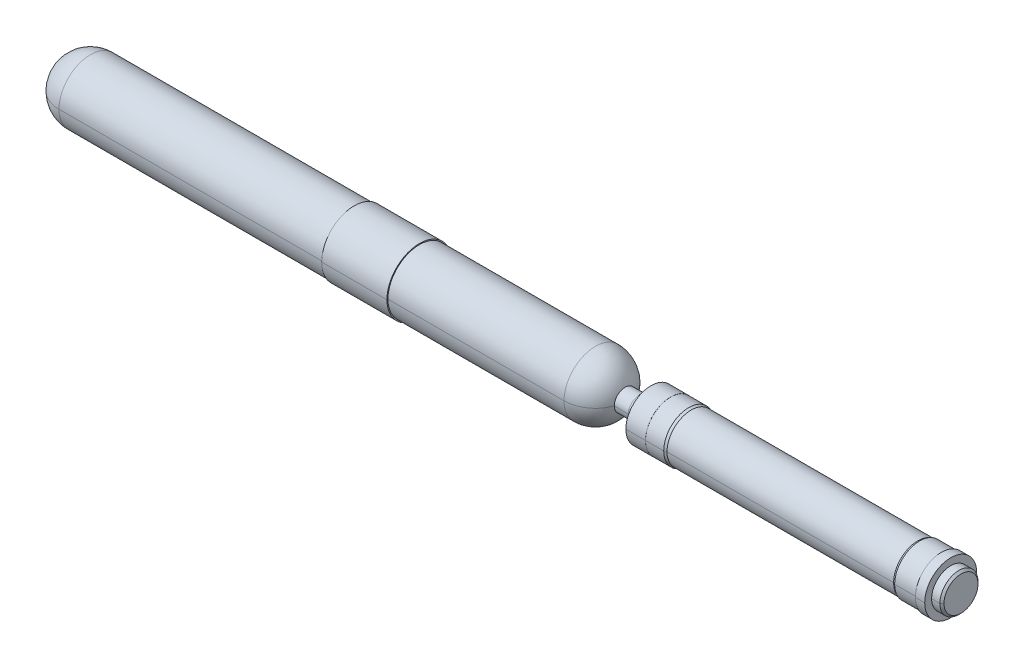
ISO-10303-21;
HEADER;
FILE_DESCRIPTION(('STEP AP214'),'2;1');
FILE_NAME('part.step','',(''),(''),'','','');
FILE_SCHEMA(('AUTOMOTIVE_DESIGN { 1 0 10303 214 1 1 1 1 }'));
ENDSEC;
DATA;
#1=APPLICATION_CONTEXT('core data for automotive mechanical design processes');
#2=APPLICATION_PROTOCOL_DEFINITION('international standard','automotive_design',2000,#1);
#3=PRODUCT_CONTEXT('',#1,'mechanical');
#4=PRODUCT('Part','Part','',(#3));
#5=PRODUCT_RELATED_PRODUCT_CATEGORY('part','',(#4));
#6=PRODUCT_DEFINITION_FORMATION('','',#4);
#7=PRODUCT_DEFINITION_CONTEXT('part definition',#1,'design');
#8=PRODUCT_DEFINITION('design','',#6,#7);
#9=PRODUCT_DEFINITION_SHAPE('','',#8);
#10=(LENGTH_UNIT() NAMED_UNIT(*) SI_UNIT(.MILLI.,.METRE.));
#11=(NAMED_UNIT(*) PLANE_ANGLE_UNIT() SI_UNIT($,.RADIAN.));
#12=(NAMED_UNIT(*) SI_UNIT($,.STERADIAN.) SOLID_ANGLE_UNIT());
#13=UNCERTAINTY_MEASURE_WITH_UNIT(LENGTH_MEASURE(1.E-05),#10,'distance_accuracy_value','');
#14=(GEOMETRIC_REPRESENTATION_CONTEXT(3) GLOBAL_UNCERTAINTY_ASSIGNED_CONTEXT((#13)) GLOBAL_UNIT_ASSIGNED_CONTEXT((#10,
#11,#12)) REPRESENTATION_CONTEXT('',''));
#15=CARTESIAN_POINT('',(0.,0.,0.));
#16=DIRECTION('',(0.,0.,1.));
#17=DIRECTION('',(1.,0.,0.));
#18=AXIS2_PLACEMENT_3D('',#15,#16,#17);
#19=CARTESIAN_POINT('',(203.869686480789,0.,-129.45108941236));
#20=DIRECTION('',(0.,-1.,0.));
#21=DIRECTION('',(0.,0.,-1.));
#22=AXIS2_PLACEMENT_3D('',#19,#20,#21);
#23=SPHERICAL_SURFACE('',#22,49.0220149271394);
#24=CARTESIAN_POINT('',(203.869686480789,0.,-129.45108941236));
#25=DIRECTION('',(0.,-1.,0.));
#26=DIRECTION('',(0.,0.,-1.));
#27=AXIS2_PLACEMENT_3D('',#24,#25,#26);
#28=CIRCLE('',#27,49.0220149271394);
#29=CARTESIAN_POINT('',(203.869686480789,0.,-80.4290744852206));
#30=VERTEX_POINT('',#29);
#31=CARTESIAN_POINT('',(154.84767155365,0.,-129.45108941236));
#32=VERTEX_POINT('',#31);
#33=EDGE_CURVE('E280',#30,#32,#28,.T.);
#34=ORIENTED_EDGE('',*,*,#33,.F.);
#35=CARTESIAN_POINT('',(203.869686480789,0.,-129.45108941236));
#36=DIRECTION('',(-1.,0.,0.));
#37=DIRECTION('',(0.,0.,1.));
#38=AXIS2_PLACEMENT_3D('',#35,#36,#37);
#39=CIRCLE('',#38,49.0220149271394);
#40=CARTESIAN_POINT('',(203.869686480789,0.,-178.473104339499));
#41=VERTEX_POINT('',#40);
#42=EDGE_CURVE('E305',#30,#41,#39,.T.);
#43=ORIENTED_EDGE('',*,*,#42,.T.);
#44=CARTESIAN_POINT('',(203.869686480789,0.,-129.45108941236));
#45=DIRECTION('',(0.,1.,0.));
#46=DIRECTION('',(0.,0.,1.));
#47=AXIS2_PLACEMENT_3D('',#44,#45,#46);
#48=CIRCLE('',#47,49.0220149271394);
#49=EDGE_CURVE('E276',#41,#32,#48,.T.);
#50=ORIENTED_EDGE('',*,*,#49,.T.);
#51=EDGE_LOOP('',(#34,#43,#50));
#52=FACE_BOUND('',#51,.T.);
#53=ADVANCED_FACE('F50',(#52),#23,.T.);
#54=CARTESIAN_POINT('',(154.84767155365,0.,-129.45108941236));
#55=DIRECTION('',(-1.,0.,0.));
#56=DIRECTION('',(0.,0.,1.));
#57=AXIS2_PLACEMENT_3D('',#54,#55,#56);
#58=CYLINDRICAL_SURFACE('',#57,49.0220149271394);
#59=DIRECTION('',(-1.,0.,0.));
#60=VECTOR('',#59,1.);
#61=CARTESIAN_POINT('',(154.84767155365,0.,-178.473104339499));
#62=LINE('',#61,#60);
#63=CARTESIAN_POINT('',(614.587811275265,0.,-178.473104339499));
#64=VERTEX_POINT('',#63);
#65=EDGE_CURVE('E308',#64,#41,#62,.T.);
#66=ORIENTED_EDGE('',*,*,#65,.F.);
#67=CARTESIAN_POINT('',(614.587811275265,0.,-129.45108941236));
#68=DIRECTION('',(1.,0.,0.));
#69=DIRECTION('',(0.,0.,1.));
#70=AXIS2_PLACEMENT_3D('',#67,#68,#69);
#71=CIRCLE('',#70,49.0220149271394);
#72=CARTESIAN_POINT('',(614.587811275265,0.,-80.4290744852206));
#73=VERTEX_POINT('',#72);
#74=EDGE_CURVE('E61',#73,#64,#71,.T.);
#75=ORIENTED_EDGE('',*,*,#74,.F.);
#76=DIRECTION('',(-1.,0.,0.));
#77=VECTOR('',#76,1.);
#78=CARTESIAN_POINT('',(154.84767155365,0.,-80.4290744852206));
#79=LINE('',#78,#77);
#80=EDGE_CURVE('E260',#73,#30,#79,.T.);
#81=ORIENTED_EDGE('',*,*,#80,.T.);
#82=CARTESIAN_POINT('',(203.869686480789,0.,-129.45108941236));
#83=DIRECTION('',(-1.,0.,0.));
#84=DIRECTION('',(0.,0.,1.));
#85=AXIS2_PLACEMENT_3D('',#82,#83,#84);
#86=CIRCLE('',#85,49.0220149271394);
#87=EDGE_CURVE('E403',#41,#30,#86,.T.);
#88=ORIENTED_EDGE('',*,*,#87,.F.);
#89=EDGE_LOOP('',(#66,#75,#81,#88));
#90=FACE_BOUND('',#89,.T.);
#91=ADVANCED_FACE('F418',(#90),#58,.T.);
#92=CARTESIAN_POINT('',(716.18784220753,0.,-178.473104339499));
#93=DIRECTION('',(-1.,0.,0.));
#94=DIRECTION('',(0.,0.,1.));
#95=AXIS2_PLACEMENT_3D('',#92,#93,#94);
#96=PLANE('',#95);
#97=CARTESIAN_POINT('',(716.18784220753,0.,-129.45108941236));
#98=DIRECTION('',(1.,0.,0.));
#99=DIRECTION('',(0.,0.,1.));
#100=AXIS2_PLACEMENT_3D('',#97,#98,#99);
#101=CIRCLE('',#100,49.0220149271394);
#102=CARTESIAN_POINT('',(716.18784220753,0.,-80.4290744852206));
#103=VERTEX_POINT('',#102);
#104=CARTESIAN_POINT('',(716.18784220753,0.,-178.473104339499));
#105=VERTEX_POINT('',#104);
#106=EDGE_CURVE('E387',#103,#105,#101,.T.);
#107=ORIENTED_EDGE('',*,*,#106,.F.);
#108=CARTESIAN_POINT('',(716.18784220753,0.,-129.45108941236));
#109=DIRECTION('',(1.,0.,0.));
#110=DIRECTION('',(0.,0.,1.));
#111=AXIS2_PLACEMENT_3D('',#108,#109,#110);
#112=CIRCLE('',#111,49.0220149271394);
#113=EDGE_CURVE('E221',#105,#103,#112,.T.);
#114=ORIENTED_EDGE('',*,*,#113,.F.);
#115=EDGE_LOOP('',(#107,#114));
#116=FACE_BOUND('',#115,.T.);
#117=CARTESIAN_POINT('',(716.18784220753,0.,-129.45108941236));
#118=DIRECTION('',(-1.,0.,0.));
#119=DIRECTION('',(0.,0.,1.));
#120=AXIS2_PLACEMENT_3D('',#117,#118,#119);
#121=CIRCLE('',#120,50.5890234587644);
#122=CARTESIAN_POINT('',(716.18784220753,0.,-78.8620659535956));
#123=VERTEX_POINT('',#122);
#124=CARTESIAN_POINT('',(716.18784220753,0.,-180.040112871125));
#125=VERTEX_POINT('',#124);
#126=EDGE_CURVE('E54',#123,#125,#121,.T.);
#127=ORIENTED_EDGE('',*,*,#126,.F.);
#128=CARTESIAN_POINT('',(716.18784220753,0.,-129.45108941236));
#129=DIRECTION('',(-1.,0.,0.));
#130=DIRECTION('',(0.,0.,1.));
#131=AXIS2_PLACEMENT_3D('',#128,#129,#130);
#132=CIRCLE('',#131,50.5890234587644);
#133=EDGE_CURVE('E11',#125,#123,#132,.T.);
#134=ORIENTED_EDGE('',*,*,#133,.F.);
#135=EDGE_LOOP('',(#127,#134));
#136=FACE_BOUND('',#135,.T.);
#137=ADVANCED_FACE('F646',(#116,#136),#96,.F.);
#138=CARTESIAN_POINT('',(154.84767155365,0.,-129.45108941236));
#139=DIRECTION('',(-1.,0.,0.));
#140=DIRECTION('',(0.,0.,1.));
#141=AXIS2_PLACEMENT_3D('',#138,#139,#140);
#142=CYLINDRICAL_SURFACE('',#141,50.5890234587644);
#143=DIRECTION('',(-1.,0.,0.));
#144=VECTOR('',#143,1.);
#145=CARTESIAN_POINT('',(154.84767155365,0.,-180.040112871125));
#146=LINE('',#145,#144);
#147=CARTESIAN_POINT('',(614.587811275265,0.,-180.040112871125));
#148=VERTEX_POINT('',#147);
#149=EDGE_CURVE('E478',#125,#148,#146,.T.);
#150=ORIENTED_EDGE('',*,*,#149,.F.);
#151=ORIENTED_EDGE('',*,*,#133,.T.);
#152=DIRECTION('',(-1.,0.,0.));
#153=VECTOR('',#152,1.);
#154=CARTESIAN_POINT('',(154.84767155365,0.,-78.8620659535956));
#155=LINE('',#154,#153);
#156=CARTESIAN_POINT('',(614.587811275265,0.,-78.8620659535956));
#157=VERTEX_POINT('',#156);
#158=EDGE_CURVE('E399',#123,#157,#155,.T.);
#159=ORIENTED_EDGE('',*,*,#158,.T.);
#160=CARTESIAN_POINT('',(614.587811275265,0.,-129.45108941236));
#161=DIRECTION('',(-1.,0.,0.));
#162=DIRECTION('',(0.,0.,1.));
#163=AXIS2_PLACEMENT_3D('',#160,#161,#162);
#164=CIRCLE('',#163,50.5890234587644);
#165=EDGE_CURVE('E383',#148,#157,#164,.T.);
#166=ORIENTED_EDGE('',*,*,#165,.F.);
#167=EDGE_LOOP('',(#150,#151,#159,#166));
#168=FACE_BOUND('',#167,.T.);
#169=ADVANCED_FACE('F635',(#168),#142,.T.);
#170=CARTESIAN_POINT('',(614.587811275265,0.,-178.473104339499));
#171=DIRECTION('',(-1.,0.,0.));
#172=DIRECTION('',(0.,0.,1.));
#173=AXIS2_PLACEMENT_3D('',#170,#171,#172);
#174=PLANE('',#173);
#175=ORIENTED_EDGE('',*,*,#74,.T.);
#176=CARTESIAN_POINT('',(614.587811275265,0.,-129.45108941236));
#177=DIRECTION('',(1.,0.,0.));
#178=DIRECTION('',(0.,0.,1.));
#179=AXIS2_PLACEMENT_3D('',#176,#177,#178);
#180=CIRCLE('',#179,49.0220149271394);
#181=EDGE_CURVE('E279',#64,#73,#180,.T.);
#182=ORIENTED_EDGE('',*,*,#181,.T.);
#183=EDGE_LOOP('',(#175,#182));
#184=FACE_BOUND('',#183,.T.);
#185=CARTESIAN_POINT('',(614.587811275265,0.,-129.45108941236));
#186=DIRECTION('',(-1.,0.,0.));
#187=DIRECTION('',(0.,0.,1.));
#188=AXIS2_PLACEMENT_3D('',#185,#186,#187);
#189=CIRCLE('',#188,50.5890234587644);
#190=EDGE_CURVE('E404',#157,#148,#189,.T.);
#191=ORIENTED_EDGE('',*,*,#190,.T.);
#192=ORIENTED_EDGE('',*,*,#165,.T.);
#193=EDGE_LOOP('',(#191,#192));
#194=FACE_BOUND('',#193,.T.);
#195=ADVANCED_FACE('F632',(#184,#194),#174,.T.);
#196=CARTESIAN_POINT('',(154.84767155365,0.,-129.45108941236));
#197=DIRECTION('',(-1.,0.,0.));
#198=DIRECTION('',(0.,0.,1.));
#199=AXIS2_PLACEMENT_3D('',#196,#197,#198);
#200=CYLINDRICAL_SURFACE('',#199,49.0220149271394);
#201=DIRECTION('',(-1.,0.,0.));
#202=VECTOR('',#201,1.);
#203=CARTESIAN_POINT('',(154.84767155365,0.,-178.473104339499));
#204=LINE('',#203,#202);
#205=CARTESIAN_POINT('',(990.357763279767,0.,-178.473104339499));
#206=VERTEX_POINT('',#205);
#207=EDGE_CURVE('E226',#206,#105,#204,.T.);
#208=ORIENTED_EDGE('',*,*,#207,.F.);
#209=CARTESIAN_POINT('',(990.357763279767,0.,-129.45108941236));
#210=DIRECTION('',(-1.,0.,0.));
#211=DIRECTION('',(0.,0.,1.));
#212=AXIS2_PLACEMENT_3D('',#209,#210,#211);
#213=CIRCLE('',#212,49.0220149271394);
#214=CARTESIAN_POINT('',(990.357763279767,0.,-80.4290744852206));
#215=VERTEX_POINT('',#214);
#216=EDGE_CURVE('E318',#206,#215,#213,.T.);
#217=ORIENTED_EDGE('',*,*,#216,.T.);
#218=DIRECTION('',(-1.,0.,0.));
#219=VECTOR('',#218,1.);
#220=CARTESIAN_POINT('',(154.84767155365,0.,-80.4290744852206));
#221=LINE('',#220,#219);
#222=EDGE_CURVE('E225',#215,#103,#221,.T.);
#223=ORIENTED_EDGE('',*,*,#222,.T.);
#224=ORIENTED_EDGE('',*,*,#106,.T.);
#225=EDGE_LOOP('',(#208,#217,#223,#224));
#226=FACE_BOUND('',#225,.T.);
#227=ADVANCED_FACE('F507',(#226),#200,.T.);
#228=CARTESIAN_POINT('',(990.357763279767,0.,-129.45108941236));
#229=DIRECTION('',(0.,-1.,0.));
#230=DIRECTION('',(0.,0.,-1.));
#231=AXIS2_PLACEMENT_3D('',#228,#229,#230);
#232=SPHERICAL_SURFACE('',#231,49.0220149271394);
#233=CARTESIAN_POINT('',(990.357763279767,0.,-129.45108941236));
#234=DIRECTION('',(0.,-1.,0.));
#235=DIRECTION('',(0.,0.,-1.));
#236=AXIS2_PLACEMENT_3D('',#233,#234,#235);
#237=CIRCLE('',#236,49.0220149271394);
#238=CARTESIAN_POINT('',(1036.40785754293,0.,-112.641961955227));
#239=VERTEX_POINT('',#238);
#240=EDGE_CURVE('E323',#239,#215,#237,.T.);
#241=ORIENTED_EDGE('',*,*,#240,.F.);
#242=CARTESIAN_POINT('',(1036.40785754293,0.,-129.45108941236));
#243=DIRECTION('',(-1.,0.,0.));
#244=DIRECTION('',(0.,0.,1.));
#245=AXIS2_PLACEMENT_3D('',#242,#243,#244);
#246=CIRCLE('',#245,16.8091274571327);
#247=CARTESIAN_POINT('',(1036.40785754293,0.,-146.260216869493));
#248=VERTEX_POINT('',#247);
#249=EDGE_CURVE('E408',#239,#248,#246,.T.);
#250=ORIENTED_EDGE('',*,*,#249,.T.);
#251=CARTESIAN_POINT('',(990.357763279767,0.,-129.45108941236));
#252=DIRECTION('',(0.,1.,0.));
#253=DIRECTION('',(0.,0.,1.));
#254=AXIS2_PLACEMENT_3D('',#251,#252,#253);
#255=CIRCLE('',#254,49.0220149271394);
#256=EDGE_CURVE('E322',#248,#206,#255,.T.);
#257=ORIENTED_EDGE('',*,*,#256,.T.);
#258=CARTESIAN_POINT('',(990.357763279767,0.,-129.45108941236));
#259=DIRECTION('',(-1.,0.,0.));
#260=DIRECTION('',(0.,0.,1.));
#261=AXIS2_PLACEMENT_3D('',#258,#259,#260);
#262=CIRCLE('',#261,49.0220149271394);
#263=EDGE_CURVE('E256',#215,#206,#262,.T.);
#264=ORIENTED_EDGE('',*,*,#263,.F.);
#265=EDGE_LOOP('',(#241,#250,#257,#264));
#266=FACE_BOUND('',#265,.T.);
#267=ADVANCED_FACE('F846',(#266),#232,.T.);
#268=CARTESIAN_POINT('',(154.84767155365,0.,-129.45108941236));
#269=DIRECTION('',(-1.,0.,0.));
#270=DIRECTION('',(0.,0.,1.));
#271=AXIS2_PLACEMENT_3D('',#268,#269,#270);
#272=CYLINDRICAL_SURFACE('',#271,16.8091274571327);
#273=DIRECTION('',(-1.,0.,0.));
#274=VECTOR('',#273,1.);
#275=CARTESIAN_POINT('',(154.84767155365,0.,-146.260216869493));
#276=LINE('',#275,#274);
#277=CARTESIAN_POINT('',(1059.24265625592,0.,-146.260216869493));
#278=VERTEX_POINT('',#277);
#279=EDGE_CURVE('E391',#278,#248,#276,.T.);
#280=ORIENTED_EDGE('',*,*,#279,.F.);
#281=CARTESIAN_POINT('',(1059.24265625592,0.,-129.45108941236));
#282=DIRECTION('',(-1.,0.,0.));
#283=DIRECTION('',(0.,0.,1.));
#284=AXIS2_PLACEMENT_3D('',#281,#282,#283);
#285=CIRCLE('',#284,16.8091274571326);
#286=CARTESIAN_POINT('',(1059.24265625592,0.,-112.641961955227));
#287=VERTEX_POINT('',#286);
#288=EDGE_CURVE('E381',#278,#287,#285,.T.);
#289=ORIENTED_EDGE('',*,*,#288,.T.);
#290=DIRECTION('',(-1.,0.,0.));
#291=VECTOR('',#290,1.);
#292=CARTESIAN_POINT('',(154.84767155365,0.,-112.641961955227));
#293=LINE('',#292,#291);
#294=EDGE_CURVE('E474',#287,#239,#293,.T.);
#295=ORIENTED_EDGE('',*,*,#294,.T.);
#296=CARTESIAN_POINT('',(1036.40785754293,0.,-129.45108941236));
#297=DIRECTION('',(-1.,0.,0.));
#298=DIRECTION('',(0.,0.,1.));
#299=AXIS2_PLACEMENT_3D('',#296,#297,#298);
#300=CIRCLE('',#299,16.8091274571327);
#301=EDGE_CURVE('E252',#248,#239,#300,.T.);
#302=ORIENTED_EDGE('',*,*,#301,.F.);
#303=EDGE_LOOP('',(#280,#289,#295,#302));
#304=FACE_BOUND('',#303,.T.);
#305=ADVANCED_FACE('F850',(#304),#272,.T.);
#306=CARTESIAN_POINT('',(1059.24265625592,0.,-146.260216869493));
#307=DIRECTION('',(-1.,0.,0.));
#308=DIRECTION('',(0.,0.,1.));
#309=AXIS2_PLACEMENT_3D('',#306,#307,#308);
#310=PLANE('',#309);
#311=CARTESIAN_POINT('',(1059.24265625592,0.,-129.45108941236));
#312=DIRECTION('',(-1.,0.,0.));
#313=DIRECTION('',(0.,0.,1.));
#314=AXIS2_PLACEMENT_3D('',#311,#312,#313);
#315=CIRCLE('',#314,16.8091274571326);
#316=EDGE_CURVE('E388',#287,#278,#315,.T.);
#317=ORIENTED_EDGE('',*,*,#316,.F.);
#318=ORIENTED_EDGE('',*,*,#288,.F.);
#319=EDGE_LOOP('',(#317,#318));
#320=FACE_BOUND('',#319,.T.);
#321=CARTESIAN_POINT('',(1059.24265625592,0.,-129.45108941236));
#322=DIRECTION('',(-1.,0.,0.));
#323=DIRECTION('',(0.,0.,1.));
#324=AXIS2_PLACEMENT_3D('',#321,#322,#323);
#325=CIRCLE('',#324,18.1868829999213);
#326=CARTESIAN_POINT('',(1059.24265625592,0.,-111.264206412439));
#327=VERTEX_POINT('',#326);
#328=CARTESIAN_POINT('',(1059.24265625592,0.,-147.637972412281));
#329=VERTEX_POINT('',#328);
#330=EDGE_CURVE('E489',#327,#329,#325,.T.);
#331=ORIENTED_EDGE('',*,*,#330,.T.);
#332=CARTESIAN_POINT('',(1059.24265625592,0.,-129.45108941236));
#333=DIRECTION('',(-1.,0.,0.));
#334=DIRECTION('',(0.,0.,1.));
#335=AXIS2_PLACEMENT_3D('',#332,#333,#334);
#336=CIRCLE('',#335,18.1868829999213);
#337=EDGE_CURVE('E378',#329,#327,#336,.T.);
#338=ORIENTED_EDGE('',*,*,#337,.T.);
#339=EDGE_LOOP('',(#331,#338));
#340=FACE_BOUND('',#339,.T.);
#341=ADVANCED_FACE('F755',(#320,#340),#310,.T.);
#342=CARTESIAN_POINT('',(154.84767155365,0.,-129.45108941236));
#343=DIRECTION('',(-1.,0.,0.));
#344=DIRECTION('',(0.,0.,1.));
#345=AXIS2_PLACEMENT_3D('',#342,#343,#344);
#346=CYLINDRICAL_SURFACE('',#345,18.1868829999213);
#347=DIRECTION('',(-1.,0.,0.));
#348=VECTOR('',#347,1.);
#349=CARTESIAN_POINT('',(154.84767155365,0.,-147.637972412281));
#350=LINE('',#349,#348);
#351=CARTESIAN_POINT('',(1069.23021838574,0.,-147.637972412281));
#352=VERTEX_POINT('',#351);
#353=EDGE_CURVE('E485',#352,#329,#350,.T.);
#354=ORIENTED_EDGE('',*,*,#353,.F.);
#355=CARTESIAN_POINT('',(1069.23021838574,0.,-129.45108941236));
#356=DIRECTION('',(-1.,0.,0.));
#357=DIRECTION('',(0.,0.,1.));
#358=AXIS2_PLACEMENT_3D('',#355,#356,#357);
#359=CIRCLE('',#358,18.1868829999213);
#360=CARTESIAN_POINT('',(1069.23021838574,0.,-111.264206412439));
#361=VERTEX_POINT('',#360);
#362=EDGE_CURVE('E382',#352,#361,#359,.T.);
#363=ORIENTED_EDGE('',*,*,#362,.T.);
#364=DIRECTION('',(-1.,0.,0.));
#365=VECTOR('',#364,1.);
#366=CARTESIAN_POINT('',(154.84767155365,0.,-111.264206412439));
#367=LINE('',#366,#365);
#368=EDGE_CURVE('E232',#361,#327,#367,.T.);
#369=ORIENTED_EDGE('',*,*,#368,.T.);
#370=ORIENTED_EDGE('',*,*,#337,.F.);
#371=EDGE_LOOP('',(#354,#363,#369,#370));
#372=FACE_BOUND('',#371,.T.);
#373=ADVANCED_FACE('F655',(#372),#346,.T.);
#374=CARTESIAN_POINT('',(1069.23021838574,0.,-129.45108941236));
#375=DIRECTION('',(1.,0.,0.));
#376=DIRECTION('',(0.,0.,-1.));
#377=AXIS2_PLACEMENT_3D('',#374,#375,#376);
#378=CONICAL_SURFACE('',#377,18.1868829999213,1.22508116170927);
#379=DIRECTION('',(0.338869615009847,0.,0.940833345509755));
#380=VECTOR('',#379,1.);
#381=CARTESIAN_POINT('',(1069.23021838574,0.,-111.264206412439));
#382=LINE('',#381,#380);
#383=CARTESIAN_POINT('',(1076.78127065806,0.,-90.2995596668755));
#384=VERTEX_POINT('',#383);
#385=EDGE_CURVE('E227',#361,#384,#382,.T.);
#386=ORIENTED_EDGE('',*,*,#385,.F.);
#387=ORIENTED_EDGE('',*,*,#362,.F.);
#388=DIRECTION('',(0.338869615009847,0.,-0.940833345509755));
#389=VECTOR('',#388,1.);
#390=CARTESIAN_POINT('',(1069.23021838574,0.,-147.637972412281));
#391=LINE('',#390,#389);
#392=CARTESIAN_POINT('',(1076.78127065806,0.,-168.602619157844));
#393=VERTEX_POINT('',#392);
#394=EDGE_CURVE('E220',#352,#393,#391,.T.);
#395=ORIENTED_EDGE('',*,*,#394,.T.);
#396=CARTESIAN_POINT('',(1076.78127065806,0.,-129.45108941236));
#397=DIRECTION('',(-1.,0.,0.));
#398=DIRECTION('',(0.,0.,1.));
#399=AXIS2_PLACEMENT_3D('',#396,#397,#398);
#400=CIRCLE('',#399,39.1515297454845);
#401=EDGE_CURVE('E290',#393,#384,#400,.T.);
#402=ORIENTED_EDGE('',*,*,#401,.T.);
#403=EDGE_LOOP('',(#386,#387,#395,#402));
#404=FACE_BOUND('',#403,.T.);
#405=ADVANCED_FACE('F649',(#404),#378,.T.);
#406=CARTESIAN_POINT('',(154.84767155365,0.,-129.45108941236));
#407=DIRECTION('',(-1.,0.,0.));
#408=DIRECTION('',(0.,0.,1.));
#409=AXIS2_PLACEMENT_3D('',#406,#407,#408);
#410=CYLINDRICAL_SURFACE('',#409,39.1515297454845);
#411=DIRECTION('',(-1.,0.,0.));
#412=VECTOR('',#411,1.);
#413=CARTESIAN_POINT('',(154.84767155365,0.,-168.602619157844));
#414=LINE('',#413,#412);
#415=CARTESIAN_POINT('',(1107.32156315835,0.,-168.602619157844));
#416=VERTEX_POINT('',#415);
#417=EDGE_CURVE('E213',#416,#393,#414,.T.);
#418=ORIENTED_EDGE('',*,*,#417,.F.);
#419=CARTESIAN_POINT('',(1107.32156315835,0.,-129.45108941236));
#420=DIRECTION('',(-1.,0.,0.));
#421=DIRECTION('',(0.,0.,1.));
#422=AXIS2_PLACEMENT_3D('',#419,#420,#421);
#423=CIRCLE('',#422,39.1515297454845);
#424=CARTESIAN_POINT('',(1107.32156315835,0.,-90.2995596668755));
#425=VERTEX_POINT('',#424);
#426=EDGE_CURVE('E287',#416,#425,#423,.T.);
#427=ORIENTED_EDGE('',*,*,#426,.T.);
#428=DIRECTION('',(-1.,0.,0.));
#429=VECTOR('',#428,1.);
#430=CARTESIAN_POINT('',(154.84767155365,0.,-90.2995596668755));
#431=LINE('',#430,#429);
#432=EDGE_CURVE('E204',#425,#384,#431,.T.);
#433=ORIENTED_EDGE('',*,*,#432,.T.);
#434=ORIENTED_EDGE('',*,*,#401,.F.);
#435=EDGE_LOOP('',(#418,#427,#433,#434));
#436=FACE_BOUND('',#435,.T.);
#437=ADVANCED_FACE('F654',(#436),#410,.T.);
#438=CARTESIAN_POINT('',(1107.32156315835,0.,-168.602619157844));
#439=DIRECTION('',(1.,0.,0.));
#440=DIRECTION('',(0.,1.,0.));
#441=AXIS2_PLACEMENT_3D('',#438,#439,#440);
#442=PLANE('',#441);
#443=CARTESIAN_POINT('',(1107.32156315835,0.,-129.45108941236));
#444=DIRECTION('',(-1.,0.,0.));
#445=DIRECTION('',(0.,0.,1.));
#446=AXIS2_PLACEMENT_3D('',#443,#444,#445);
#447=CIRCLE('',#446,39.0248573700333);
#448=CARTESIAN_POINT('',(1107.32156315835,0.,-90.4262320423267));
#449=VERTEX_POINT('',#448);
#450=CARTESIAN_POINT('',(1107.32156315835,0.,-168.475946782393));
#451=VERTEX_POINT('',#450);
#452=EDGE_CURVE('E198',#449,#451,#447,.T.);
#453=ORIENTED_EDGE('',*,*,#452,.T.);
#454=CARTESIAN_POINT('',(1107.32156315835,0.,-129.45108941236));
#455=DIRECTION('',(-1.,0.,0.));
#456=DIRECTION('',(0.,0.,1.));
#457=AXIS2_PLACEMENT_3D('',#454,#455,#456);
#458=CIRCLE('',#457,39.0248573700333);
#459=EDGE_CURVE('E178',#451,#449,#458,.T.);
#460=ORIENTED_EDGE('',*,*,#459,.T.);
#461=EDGE_LOOP('',(#453,#460));
#462=FACE_BOUND('',#461,.T.);
#463=CARTESIAN_POINT('',(1107.32156315835,0.,-129.45108941236));
#464=DIRECTION('',(-1.,0.,0.));
#465=DIRECTION('',(0.,0.,1.));
#466=AXIS2_PLACEMENT_3D('',#463,#464,#465);
#467=CIRCLE('',#466,39.1515297454845);
#468=EDGE_CURVE('E217',#425,#416,#467,.T.);
#469=ORIENTED_EDGE('',*,*,#468,.F.);
#470=ORIENTED_EDGE('',*,*,#426,.F.);
#471=EDGE_LOOP('',(#469,#470));
#472=FACE_BOUND('',#471,.T.);
#473=ADVANCED_FACE('F763',(#462,#472),#442,.T.);
#474=CARTESIAN_POINT('',(154.84767155365,0.,-129.45108941236));
#475=DIRECTION('',(-1.,0.,0.));
#476=DIRECTION('',(0.,0.,1.));
#477=AXIS2_PLACEMENT_3D('',#474,#475,#476);
#478=CYLINDRICAL_SURFACE('',#477,39.0248573700333);
#479=DIRECTION('',(-1.,0.,0.));
#480=VECTOR('',#479,1.);
#481=CARTESIAN_POINT('',(154.84767155365,0.,-168.475946782393));
#482=LINE('',#481,#480);
#483=CARTESIAN_POINT('',(1135.59411632197,0.,-168.475946782393));
#484=VERTEX_POINT('',#483);
#485=EDGE_CURVE('E172',#484,#451,#482,.T.);
#486=ORIENTED_EDGE('',*,*,#485,.F.);
#487=CARTESIAN_POINT('',(1135.59411632197,0.,-129.45108941236));
#488=DIRECTION('',(-1.,0.,0.));
#489=DIRECTION('',(0.,0.,1.));
#490=AXIS2_PLACEMENT_3D('',#487,#488,#489);
#491=CIRCLE('',#490,39.0248573700333);
#492=CARTESIAN_POINT('',(1135.59411632197,0.,-90.4262320423267));
#493=VERTEX_POINT('',#492);
#494=EDGE_CURVE('E163',#484,#493,#491,.T.);
#495=ORIENTED_EDGE('',*,*,#494,.T.);
#496=DIRECTION('',(-1.,0.,0.));
#497=VECTOR('',#496,1.);
#498=CARTESIAN_POINT('',(154.84767155365,0.,-90.4262320423267));
#499=LINE('',#498,#497);
#500=EDGE_CURVE('E169',#493,#449,#499,.T.);
#501=ORIENTED_EDGE('',*,*,#500,.T.);
#502=ORIENTED_EDGE('',*,*,#459,.F.);
#503=EDGE_LOOP('',(#486,#495,#501,#502));
#504=FACE_BOUND('',#503,.T.);
#505=ADVANCED_FACE('F165',(#504),#478,.T.);
#506=CARTESIAN_POINT('',(1135.59411632197,0.,-129.45108941236));
#507=DIRECTION('',(-1.,0.,0.));
#508=DIRECTION('',(0.,0.,1.));
#509=AXIS2_PLACEMENT_3D('',#506,#507,#508);
#510=CONICAL_SURFACE('',#509,39.0248573700333,0.345228751143972);
#511=DIRECTION('',(-0.940998065108512,0.,-0.338411940483838));
#512=VECTOR('',#511,1.);
#513=CARTESIAN_POINT('',(1135.59411632197,0.,-168.475946782393));
#514=LINE('',#513,#512);
#515=CARTESIAN_POINT('',(1139.4017592952,0.,-167.106600877211));
#516=VERTEX_POINT('',#515);
#517=EDGE_CURVE('E192',#516,#484,#514,.T.);
#518=ORIENTED_EDGE('',*,*,#517,.F.);
#519=CARTESIAN_POINT('',(1139.4017592952,0.,-129.45108941236));
#520=DIRECTION('',(-1.,0.,0.));
#521=DIRECTION('',(0.,0.,1.));
#522=AXIS2_PLACEMENT_3D('',#519,#520,#521);
#523=CIRCLE('',#522,37.6555114648513);
#524=CARTESIAN_POINT('',(1139.4017592952,0.,-91.7955779475087));
#525=VERTEX_POINT('',#524);
#526=EDGE_CURVE('E179',#516,#525,#523,.T.);
#527=ORIENTED_EDGE('',*,*,#526,.T.);
#528=DIRECTION('',(-0.940998065108512,0.,0.338411940483838));
#529=VECTOR('',#528,1.);
#530=CARTESIAN_POINT('',(1135.59411632197,0.,-90.4262320423267));
#531=LINE('',#530,#529);
#532=EDGE_CURVE('E183',#525,#493,#531,.T.);
#533=ORIENTED_EDGE('',*,*,#532,.T.);
#534=ORIENTED_EDGE('',*,*,#494,.F.);
#535=EDGE_LOOP('',(#518,#527,#533,#534));
#536=FACE_BOUND('',#535,.T.);
#537=ADVANCED_FACE('F184',(#536),#510,.T.);
#538=CARTESIAN_POINT('',(154.84767155365,0.,-129.45108941236));
#539=DIRECTION('',(-1.,0.,0.));
#540=DIRECTION('',(0.,0.,1.));
#541=AXIS2_PLACEMENT_3D('',#538,#539,#540);
#542=CYLINDRICAL_SURFACE('',#541,37.6555114648513);
#543=DIRECTION('',(-1.,0.,0.));
#544=VECTOR('',#543,1.);
#545=CARTESIAN_POINT('',(154.84767155365,0.,-167.106600877211));
#546=LINE('',#545,#544);
#547=CARTESIAN_POINT('',(1492.22538681784,0.,-167.106600877211));
#548=VERTEX_POINT('',#547);
#549=EDGE_CURVE('E309',#548,#516,#546,.T.);
#550=ORIENTED_EDGE('',*,*,#549,.F.);
#551=CARTESIAN_POINT('',(1492.22538681784,0.,-129.45108941236));
#552=DIRECTION('',(-1.,0.,0.));
#553=DIRECTION('',(0.,0.,1.));
#554=AXIS2_PLACEMENT_3D('',#551,#552,#553);
#555=CIRCLE('',#554,37.6555114648513);
#556=CARTESIAN_POINT('',(1492.22538681784,0.,-91.7955779475087));
#557=VERTEX_POINT('',#556);
#558=EDGE_CURVE('E248',#548,#557,#555,.T.);
#559=ORIENTED_EDGE('',*,*,#558,.T.);
#560=DIRECTION('',(-1.,0.,0.));
#561=VECTOR('',#560,1.);
#562=CARTESIAN_POINT('',(154.84767155365,0.,-91.7955779475087));
#563=LINE('',#562,#561);
#564=EDGE_CURVE('E313',#557,#525,#563,.T.);
#565=ORIENTED_EDGE('',*,*,#564,.T.);
#566=ORIENTED_EDGE('',*,*,#526,.F.);
#567=EDGE_LOOP('',(#550,#559,#565,#566));
#568=FACE_BOUND('',#567,.T.);
#569=ADVANCED_FACE('F660',(#568),#542,.T.);
#570=CARTESIAN_POINT('',(1492.22538681784,0.,-129.45108941236));
#571=DIRECTION('',(1.,0.,0.));
#572=DIRECTION('',(0.,0.,-1.));
#573=AXIS2_PLACEMENT_3D('',#570,#571,#572);
#574=CONICAL_SURFACE('',#573,37.6555114648513,0.428583765903435);
#575=DIRECTION('',(0.909555224556997,0.,0.415583076509463));
#576=VECTOR('',#575,1.);
#577=CARTESIAN_POINT('',(1492.22538681784,0.,-91.7955779475087));
#578=LINE('',#577,#576);
#579=CARTESIAN_POINT('',(1495.22237055632,0.,-90.4262320423267));
#580=VERTEX_POINT('',#579);
#581=EDGE_CURVE('E245',#557,#580,#578,.T.);
#582=ORIENTED_EDGE('',*,*,#581,.F.);
#583=ORIENTED_EDGE('',*,*,#558,.F.);
#584=DIRECTION('',(0.909555224556997,0.,-0.415583076509463));
#585=VECTOR('',#584,1.);
#586=CARTESIAN_POINT('',(1492.22538681784,0.,-167.106600877211));
#587=LINE('',#586,#585);
#588=CARTESIAN_POINT('',(1495.22237055632,0.,-168.475946782393));
#589=VERTEX_POINT('',#588);
#590=EDGE_CURVE('E244',#548,#589,#587,.T.);
#591=ORIENTED_EDGE('',*,*,#590,.T.);
#592=CARTESIAN_POINT('',(1495.22237055632,0.,-129.45108941236));
#593=DIRECTION('',(-1.,0.,0.));
#594=DIRECTION('',(0.,0.,1.));
#595=AXIS2_PLACEMENT_3D('',#592,#593,#594);
#596=CIRCLE('',#595,39.0248573700333);
#597=EDGE_CURVE('E452',#589,#580,#596,.T.);
#598=ORIENTED_EDGE('',*,*,#597,.T.);
#599=EDGE_LOOP('',(#582,#583,#591,#598));
#600=FACE_BOUND('',#599,.T.);
#601=ADVANCED_FACE('F664',(#600),#574,.T.);
#602=CARTESIAN_POINT('',(154.84767155365,0.,-129.45108941236));
#603=DIRECTION('',(-1.,0.,0.));
#604=DIRECTION('',(0.,0.,1.));
#605=AXIS2_PLACEMENT_3D('',#602,#603,#604);
#606=CYLINDRICAL_SURFACE('',#605,39.0248573700333);
#607=DIRECTION('',(-1.,0.,0.));
#608=VECTOR('',#607,1.);
#609=CARTESIAN_POINT('',(154.84767155365,0.,-168.475946782393));
#610=LINE('',#609,#608);
#611=CARTESIAN_POINT('',(1528.98808991887,0.,-168.475946782393));
#612=VERTEX_POINT('',#611);
#613=EDGE_CURVE('E261',#612,#589,#610,.T.);
#614=ORIENTED_EDGE('',*,*,#613,.F.);
#615=CARTESIAN_POINT('',(1528.98808991887,0.,-129.45108941236));
#616=DIRECTION('',(-1.,0.,0.));
#617=DIRECTION('',(0.,0.,1.));
#618=AXIS2_PLACEMENT_3D('',#615,#616,#617);
#619=CIRCLE('',#618,39.0248573700333);
#620=CARTESIAN_POINT('',(1528.98808991887,0.,-90.4262320423267));
#621=VERTEX_POINT('',#620);
#622=EDGE_CURVE('E299',#612,#621,#619,.T.);
#623=ORIENTED_EDGE('',*,*,#622,.T.);
#624=DIRECTION('',(-1.,0.,0.));
#625=VECTOR('',#624,1.);
#626=CARTESIAN_POINT('',(154.84767155365,0.,-90.4262320423267));
#627=LINE('',#626,#625);
#628=EDGE_CURVE('E265',#621,#580,#627,.T.);
#629=ORIENTED_EDGE('',*,*,#628,.T.);
#630=ORIENTED_EDGE('',*,*,#597,.F.);
#631=EDGE_LOOP('',(#614,#623,#629,#630));
#632=FACE_BOUND('',#631,.T.);
#633=ADVANCED_FACE('F587',(#632),#606,.T.);
#634=CARTESIAN_POINT('',(1528.98808991887,0.,-168.475946782393));
#635=DIRECTION('',(-1.,0.,0.));
#636=DIRECTION('',(0.,0.,1.));
#637=AXIS2_PLACEMENT_3D('',#634,#635,#636);
#638=PLANE('',#637);
#639=CARTESIAN_POINT('',(1528.98808991887,0.,-129.45108941236));
#640=DIRECTION('',(-1.,0.,0.));
#641=DIRECTION('',(0.,0.,1.));
#642=AXIS2_PLACEMENT_3D('',#639,#640,#641);
#643=CIRCLE('',#642,39.0248573700333);
#644=EDGE_CURVE('E266',#621,#612,#643,.T.);
#645=ORIENTED_EDGE('',*,*,#644,.F.);
#646=ORIENTED_EDGE('',*,*,#622,.F.);
#647=EDGE_LOOP('',(#645,#646));
#648=FACE_BOUND('',#647,.T.);
#649=CARTESIAN_POINT('',(1528.98808991887,0.,-129.45108941236));
#650=DIRECTION('',(-1.,0.,0.));
#651=DIRECTION('',(0.,0.,1.));
#652=AXIS2_PLACEMENT_3D('',#649,#650,#651);
#653=CIRCLE('',#652,40.5190390789063);
#654=CARTESIAN_POINT('',(1528.98808991887,0.,-88.9320503334536));
#655=VERTEX_POINT('',#654);
#656=CARTESIAN_POINT('',(1528.98808991887,0.,-169.970128491267));
#657=VERTEX_POINT('',#656);
#658=EDGE_CURVE('E358',#655,#657,#653,.T.);
#659=ORIENTED_EDGE('',*,*,#658,.T.);
#660=CARTESIAN_POINT('',(1528.98808991887,0.,-129.45108941236));
#661=DIRECTION('',(-1.,0.,0.));
#662=DIRECTION('',(0.,0.,1.));
#663=AXIS2_PLACEMENT_3D('',#660,#661,#662);
#664=CIRCLE('',#663,40.5190390789063);
#665=EDGE_CURVE('E285',#657,#655,#664,.T.);
#666=ORIENTED_EDGE('',*,*,#665,.T.);
#667=EDGE_LOOP('',(#659,#666));
#668=FACE_BOUND('',#667,.T.);
#669=ADVANCED_FACE('F582',(#648,#668),#638,.T.);
#670=CARTESIAN_POINT('',(154.84767155365,0.,-129.45108941236));
#671=DIRECTION('',(-1.,0.,0.));
#672=DIRECTION('',(0.,0.,1.));
#673=AXIS2_PLACEMENT_3D('',#670,#671,#672);
#674=CYLINDRICAL_SURFACE('',#673,40.5190390789063);
#675=DIRECTION('',(-1.,0.,0.));
#676=VECTOR('',#675,1.);
#677=CARTESIAN_POINT('',(154.84767155365,0.,-169.970128491267));
#678=LINE('',#677,#676);
#679=CARTESIAN_POINT('',(1543.49566004502,0.,-169.970128491267));
#680=VERTEX_POINT('',#679);
#681=EDGE_CURVE('E304',#680,#657,#678,.T.);
#682=ORIENTED_EDGE('',*,*,#681,.F.);
#683=CARTESIAN_POINT('',(1543.49566004502,0.,-129.45108941236));
#684=DIRECTION('',(-1.,0.,0.));
#685=DIRECTION('',(0.,0.,1.));
#686=AXIS2_PLACEMENT_3D('',#683,#684,#685);
#687=CIRCLE('',#686,40.5190390789063);
#688=CARTESIAN_POINT('',(1543.49566004502,0.,-88.9320503334536));
#689=VERTEX_POINT('',#688);
#690=EDGE_CURVE('E282',#680,#689,#687,.T.);
#691=ORIENTED_EDGE('',*,*,#690,.T.);
#692=DIRECTION('',(-1.,0.,0.));
#693=VECTOR('',#692,1.);
#694=CARTESIAN_POINT('',(154.84767155365,0.,-88.9320503334536));
#695=LINE('',#694,#693);
#696=EDGE_CURVE('E351',#689,#655,#695,.T.);
#697=ORIENTED_EDGE('',*,*,#696,.T.);
#698=ORIENTED_EDGE('',*,*,#665,.F.);
#699=EDGE_LOOP('',(#682,#691,#697,#698));
#700=FACE_BOUND('',#699,.T.);
#701=ADVANCED_FACE('F679',(#700),#674,.T.);
#702=CARTESIAN_POINT('',(1543.49566004502,0.,-169.970128491267));
#703=DIRECTION('',(1.,0.,0.));
#704=DIRECTION('',(0.,1.,0.));
#705=AXIS2_PLACEMENT_3D('',#702,#703,#704);
#706=PLANE('',#705);
#707=CARTESIAN_POINT('',(1543.49566004502,0.,-129.45108941236));
#708=DIRECTION('',(-1.,0.,0.));
#709=DIRECTION('',(0.,0.,1.));
#710=AXIS2_PLACEMENT_3D('',#707,#708,#709);
#711=CIRCLE('',#710,29.7214020586318);
#712=CARTESIAN_POINT('',(1543.49566004502,0.,-99.7296873537281));
#713=VERTEX_POINT('',#712);
#714=CARTESIAN_POINT('',(1543.49566004502,0.,-159.172491470992));
#715=VERTEX_POINT('',#714);
#716=EDGE_CURVE('E317',#713,#715,#711,.T.);
#717=ORIENTED_EDGE('',*,*,#716,.T.);
#718=CARTESIAN_POINT('',(1543.49566004502,0.,-129.45108941236));
#719=DIRECTION('',(-1.,0.,0.));
#720=DIRECTION('',(0.,0.,1.));
#721=AXIS2_PLACEMENT_3D('',#718,#719,#720);
#722=CIRCLE('',#721,29.7214020586318);
#723=EDGE_CURVE('E286',#715,#713,#722,.T.);
#724=ORIENTED_EDGE('',*,*,#723,.T.);
#725=EDGE_LOOP('',(#717,#724));
#726=FACE_BOUND('',#725,.T.);
#727=CARTESIAN_POINT('',(1543.49566004502,0.,-129.45108941236));
#728=DIRECTION('',(-1.,0.,0.));
#729=DIRECTION('',(0.,0.,1.));
#730=AXIS2_PLACEMENT_3D('',#727,#728,#729);
#731=CIRCLE('',#730,40.5190390789063);
#732=EDGE_CURVE('E300',#689,#680,#731,.T.);
#733=ORIENTED_EDGE('',*,*,#732,.F.);
#734=ORIENTED_EDGE('',*,*,#690,.F.);
#735=EDGE_LOOP('',(#733,#734));
#736=FACE_BOUND('',#735,.T.);
#737=ADVANCED_FACE('F683',(#726,#736),#706,.T.);
#738=CARTESIAN_POINT('',(154.84767155365,0.,-129.45108941236));
#739=DIRECTION('',(-1.,0.,0.));
#740=DIRECTION('',(0.,0.,1.));
#741=AXIS2_PLACEMENT_3D('',#738,#739,#740);
#742=CYLINDRICAL_SURFACE('',#741,29.7214020586318);
#743=DIRECTION('',(-1.,0.,0.));
#744=VECTOR('',#743,1.);
#745=CARTESIAN_POINT('',(154.84767155365,0.,-159.172491470992));
#746=LINE('',#745,#744);
#747=CARTESIAN_POINT('',(1556.24204721176,0.,-159.172491470992));
#748=VERTEX_POINT('',#747);
#749=EDGE_CURVE('E341',#748,#715,#746,.T.);
#750=ORIENTED_EDGE('',*,*,#749,.F.);
#751=CARTESIAN_POINT('',(1556.24204721176,0.,-129.45108941236));
#752=DIRECTION('',(-1.,0.,0.));
#753=DIRECTION('',(0.,0.,1.));
#754=AXIS2_PLACEMENT_3D('',#751,#752,#753);
#755=CIRCLE('',#754,29.7214020586318);
#756=CARTESIAN_POINT('',(1556.24204721176,0.,-99.7296873537281));
#757=VERTEX_POINT('',#756);
#758=EDGE_CURVE('E269',#748,#757,#755,.T.);
#759=ORIENTED_EDGE('',*,*,#758,.T.);
#760=DIRECTION('',(-1.,0.,0.));
#761=VECTOR('',#760,1.);
#762=CARTESIAN_POINT('',(154.84767155365,0.,-99.7296873537281));
#763=LINE('',#762,#761);
#764=EDGE_CURVE('E295',#757,#713,#763,.T.);
#765=ORIENTED_EDGE('',*,*,#764,.T.);
#766=ORIENTED_EDGE('',*,*,#723,.F.);
#767=EDGE_LOOP('',(#750,#759,#765,#766));
#768=FACE_BOUND('',#767,.T.);
#769=ADVANCED_FACE('F342',(#768),#742,.T.);
#770=CARTESIAN_POINT('',(1556.24204721176,0.,-129.45108941236));
#771=DIRECTION('',(-1.,0.,0.));
#772=DIRECTION('',(0.,0.,1.));
#773=AXIS2_PLACEMENT_3D('',#770,#771,#772);
#774=CONICAL_SURFACE('',#773,29.7214020586318,0.783615354597344);
#775=DIRECTION('',(-0.708366292974507,0.,-0.705845021925886));
#776=VECTOR('',#775,1.);
#777=CARTESIAN_POINT('',(1556.24204721176,0.,-159.172491470992));
#778=LINE('',#777,#776);
#779=CARTESIAN_POINT('',(1559.46809913103,0.,-155.95792196045));
#780=VERTEX_POINT('',#779);
#781=EDGE_CURVE('E237',#780,#748,#778,.T.);
#782=ORIENTED_EDGE('',*,*,#781,.F.);
#783=CARTESIAN_POINT('',(1559.46809913103,0.,-129.45108941236));
#784=DIRECTION('',(-1.,0.,0.));
#785=DIRECTION('',(0.,0.,1.));
#786=AXIS2_PLACEMENT_3D('',#783,#784,#785);
#787=CIRCLE('',#786,26.5068325480897);
#788=CARTESIAN_POINT('',(1559.46809913103,0.,-102.94425686427));
#789=VERTEX_POINT('',#788);
#790=EDGE_CURVE('E73',#780,#789,#787,.T.);
#791=ORIENTED_EDGE('',*,*,#790,.T.);
#792=DIRECTION('',(-0.708366292974507,0.,0.705845021925886));
#793=VECTOR('',#792,1.);
#794=CARTESIAN_POINT('',(1556.24204721176,0.,-99.7296873537281));
#795=LINE('',#794,#793);
#796=EDGE_CURVE('E233',#789,#757,#795,.T.);
#797=ORIENTED_EDGE('',*,*,#796,.T.);
#798=ORIENTED_EDGE('',*,*,#758,.F.);
#799=EDGE_LOOP('',(#782,#791,#797,#798));
#800=FACE_BOUND('',#799,.T.);
#801=ADVANCED_FACE('F674',(#800),#774,.T.);
#802=CARTESIAN_POINT('',(1559.46809913103,0.,-155.95792196045));
#803=DIRECTION('',(1.,0.,0.));
#804=DIRECTION('',(0.,1.,0.));
#805=AXIS2_PLACEMENT_3D('',#802,#803,#804);
#806=PLANE('',#805);
#807=CARTESIAN_POINT('',(1559.46809913103,0.,-129.45108941236));
#808=DIRECTION('',(-1.,0.,0.));
#809=DIRECTION('',(0.,0.,1.));
#810=AXIS2_PLACEMENT_3D('',#807,#808,#809);
#811=CIRCLE('',#810,26.5068325480897);
#812=EDGE_CURVE('E291',#789,#780,#811,.T.);
#813=ORIENTED_EDGE('',*,*,#812,.F.);
#814=ORIENTED_EDGE('',*,*,#790,.F.);
#815=EDGE_LOOP('',(#813,#814));
#816=FACE_BOUND('',#815,.T.);
#817=ADVANCED_FACE('F670',(#816),#806,.T.);
#818=CARTESIAN_POINT('',(1556.24204721176,0.,-129.45108941236));
#819=DIRECTION('',(-1.,0.,0.));
#820=DIRECTION('',(0.,0.,1.));
#821=AXIS2_PLACEMENT_3D('',#818,#819,#820);
#822=CONICAL_SURFACE('',#821,29.7214020586318,0.783615354597344);
#823=ORIENTED_EDGE('',*,*,#812,.T.);
#824=ORIENTED_EDGE('',*,*,#781,.T.);
#825=CARTESIAN_POINT('',(1556.24204721176,0.,-129.45108941236));
#826=DIRECTION('',(-1.,0.,0.));
#827=DIRECTION('',(0.,0.,1.));
#828=AXIS2_PLACEMENT_3D('',#825,#826,#827);
#829=CIRCLE('',#828,29.7214020586318);
#830=EDGE_CURVE('E335',#757,#748,#829,.T.);
#831=ORIENTED_EDGE('',*,*,#830,.F.);
#832=ORIENTED_EDGE('',*,*,#796,.F.);
#833=EDGE_LOOP('',(#823,#824,#831,#832));
#834=FACE_BOUND('',#833,.T.);
#835=ADVANCED_FACE('F52',(#834),#822,.T.);
#836=CARTESIAN_POINT('',(154.84767155365,0.,-129.45108941236));
#837=DIRECTION('',(-1.,0.,0.));
#838=DIRECTION('',(0.,0.,1.));
#839=AXIS2_PLACEMENT_3D('',#836,#837,#838);
#840=CYLINDRICAL_SURFACE('',#839,29.7214020586318);
#841=ORIENTED_EDGE('',*,*,#830,.T.);
#842=ORIENTED_EDGE('',*,*,#749,.T.);
#843=ORIENTED_EDGE('',*,*,#716,.F.);
#844=ORIENTED_EDGE('',*,*,#764,.F.);
#845=EDGE_LOOP('',(#841,#842,#843,#844));
#846=FACE_BOUND('',#845,.T.);
#847=ADVANCED_FACE('F349',(#846),#840,.T.);
#848=CARTESIAN_POINT('',(154.84767155365,0.,-129.45108941236));
#849=DIRECTION('',(-1.,0.,0.));
#850=DIRECTION('',(0.,0.,1.));
#851=AXIS2_PLACEMENT_3D('',#848,#849,#850);
#852=CYLINDRICAL_SURFACE('',#851,40.5190390789063);
#853=ORIENTED_EDGE('',*,*,#732,.T.);
#854=ORIENTED_EDGE('',*,*,#681,.T.);
#855=ORIENTED_EDGE('',*,*,#658,.F.);
#856=ORIENTED_EDGE('',*,*,#696,.F.);
#857=EDGE_LOOP('',(#853,#854,#855,#856));
#858=FACE_BOUND('',#857,.T.);
#859=ADVANCED_FACE('F833',(#858),#852,.T.);
#860=CARTESIAN_POINT('',(154.84767155365,0.,-129.45108941236));
#861=DIRECTION('',(-1.,0.,0.));
#862=DIRECTION('',(0.,0.,1.));
#863=AXIS2_PLACEMENT_3D('',#860,#861,#862);
#864=CYLINDRICAL_SURFACE('',#863,39.0248573700333);
#865=ORIENTED_EDGE('',*,*,#644,.T.);
#866=ORIENTED_EDGE('',*,*,#613,.T.);
#867=CARTESIAN_POINT('',(1495.22237055632,0.,-129.45108941236));
#868=DIRECTION('',(-1.,0.,0.));
#869=DIRECTION('',(0.,0.,1.));
#870=AXIS2_PLACEMENT_3D('',#867,#868,#869);
#871=CIRCLE('',#870,39.0248573700333);
#872=EDGE_CURVE('E240',#580,#589,#871,.T.);
#873=ORIENTED_EDGE('',*,*,#872,.F.);
#874=ORIENTED_EDGE('',*,*,#628,.F.);
#875=EDGE_LOOP('',(#865,#866,#873,#874));
#876=FACE_BOUND('',#875,.T.);
#877=ADVANCED_FACE('F590',(#876),#864,.T.);
#878=CARTESIAN_POINT('',(1492.22538681784,0.,-129.45108941236));
#879=DIRECTION('',(1.,0.,0.));
#880=DIRECTION('',(0.,0.,-1.));
#881=AXIS2_PLACEMENT_3D('',#878,#879,#880);
#882=CONICAL_SURFACE('',#881,37.6555114648513,0.428583765903435);
#883=CARTESIAN_POINT('',(1492.22538681784,0.,-129.45108941236));
#884=DIRECTION('',(-1.,0.,0.));
#885=DIRECTION('',(0.,0.,1.));
#886=AXIS2_PLACEMENT_3D('',#883,#884,#885);
#887=CIRCLE('',#886,37.6555114648513);
#888=EDGE_CURVE('E191',#557,#548,#887,.T.);
#889=ORIENTED_EDGE('',*,*,#888,.F.);
#890=ORIENTED_EDGE('',*,*,#581,.T.);
#891=ORIENTED_EDGE('',*,*,#872,.T.);
#892=ORIENTED_EDGE('',*,*,#590,.F.);
#893=EDGE_LOOP('',(#889,#890,#891,#892));
#894=FACE_BOUND('',#893,.T.);
#895=ADVANCED_FACE('F734',(#894),#882,.T.);
#896=CARTESIAN_POINT('',(154.84767155365,0.,-129.45108941236));
#897=DIRECTION('',(-1.,0.,0.));
#898=DIRECTION('',(0.,0.,1.));
#899=AXIS2_PLACEMENT_3D('',#896,#897,#898);
#900=CYLINDRICAL_SURFACE('',#899,37.6555114648513);
#901=ORIENTED_EDGE('',*,*,#888,.T.);
#902=ORIENTED_EDGE('',*,*,#549,.T.);
#903=CARTESIAN_POINT('',(1139.4017592952,0.,-129.45108941236));
#904=DIRECTION('',(-1.,0.,0.));
#905=DIRECTION('',(0.,0.,1.));
#906=AXIS2_PLACEMENT_3D('',#903,#904,#905);
#907=CIRCLE('',#906,37.6555114648513);
#908=EDGE_CURVE('E200',#525,#516,#907,.T.);
#909=ORIENTED_EDGE('',*,*,#908,.F.);
#910=ORIENTED_EDGE('',*,*,#564,.F.);
#911=EDGE_LOOP('',(#901,#902,#909,#910));
#912=FACE_BOUND('',#911,.T.);
#913=ADVANCED_FACE('F730',(#912),#900,.T.);
#914=CARTESIAN_POINT('',(1135.59411632197,0.,-129.45108941236));
#915=DIRECTION('',(-1.,0.,0.));
#916=DIRECTION('',(0.,0.,1.));
#917=AXIS2_PLACEMENT_3D('',#914,#915,#916);
#918=CONICAL_SURFACE('',#917,39.0248573700333,0.345228751143972);
#919=ORIENTED_EDGE('',*,*,#908,.T.);
#920=ORIENTED_EDGE('',*,*,#517,.T.);
#921=CARTESIAN_POINT('',(1135.59411632197,0.,-129.45108941236));
#922=DIRECTION('',(-1.,0.,0.));
#923=DIRECTION('',(0.,0.,1.));
#924=AXIS2_PLACEMENT_3D('',#921,#922,#923);
#925=CIRCLE('',#924,39.0248573700333);
#926=EDGE_CURVE('E196',#493,#484,#925,.T.);
#927=ORIENTED_EDGE('',*,*,#926,.F.);
#928=ORIENTED_EDGE('',*,*,#532,.F.);
#929=EDGE_LOOP('',(#919,#920,#927,#928));
#930=FACE_BOUND('',#929,.T.);
#931=ADVANCED_FACE('F202',(#930),#918,.T.);
#932=CARTESIAN_POINT('',(154.84767155365,0.,-129.45108941236));
#933=DIRECTION('',(-1.,0.,0.));
#934=DIRECTION('',(0.,0.,1.));
#935=AXIS2_PLACEMENT_3D('',#932,#933,#934);
#936=CYLINDRICAL_SURFACE('',#935,39.0248573700333);
#937=ORIENTED_EDGE('',*,*,#926,.T.);
#938=ORIENTED_EDGE('',*,*,#485,.T.);
#939=ORIENTED_EDGE('',*,*,#452,.F.);
#940=ORIENTED_EDGE('',*,*,#500,.F.);
#941=EDGE_LOOP('',(#937,#938,#939,#940));
#942=FACE_BOUND('',#941,.T.);
#943=ADVANCED_FACE('F195',(#942),#936,.T.);
#944=CARTESIAN_POINT('',(154.84767155365,0.,-129.45108941236));
#945=DIRECTION('',(-1.,0.,0.));
#946=DIRECTION('',(0.,0.,1.));
#947=AXIS2_PLACEMENT_3D('',#944,#945,#946);
#948=CYLINDRICAL_SURFACE('',#947,39.1515297454845);
#949=ORIENTED_EDGE('',*,*,#468,.T.);
#950=ORIENTED_EDGE('',*,*,#417,.T.);
#951=CARTESIAN_POINT('',(1076.78127065806,0.,-129.45108941236));
#952=DIRECTION('',(-1.,0.,0.));
#953=DIRECTION('',(0.,0.,1.));
#954=AXIS2_PLACEMENT_3D('',#951,#952,#953);
#955=CIRCLE('',#954,39.1515297454845);
#956=EDGE_CURVE('E231',#384,#393,#955,.T.);
#957=ORIENTED_EDGE('',*,*,#956,.F.);
#958=ORIENTED_EDGE('',*,*,#432,.F.);
#959=EDGE_LOOP('',(#949,#950,#957,#958));
#960=FACE_BOUND('',#959,.T.);
#961=ADVANCED_FACE('F724',(#960),#948,.T.);
#962=CARTESIAN_POINT('',(1069.23021838574,0.,-129.45108941236));
#963=DIRECTION('',(1.,0.,0.));
#964=DIRECTION('',(0.,0.,-1.));
#965=AXIS2_PLACEMENT_3D('',#962,#963,#964);
#966=CONICAL_SURFACE('',#965,18.1868829999213,1.22508116170927);
#967=CARTESIAN_POINT('',(1069.23021838574,0.,-129.45108941236));
#968=DIRECTION('',(-1.,0.,0.));
#969=DIRECTION('',(0.,0.,1.));
#970=AXIS2_PLACEMENT_3D('',#967,#968,#969);
#971=CIRCLE('',#970,18.1868829999213);
#972=EDGE_CURVE('E490',#361,#352,#971,.T.);
#973=ORIENTED_EDGE('',*,*,#972,.F.);
#974=ORIENTED_EDGE('',*,*,#385,.T.);
#975=ORIENTED_EDGE('',*,*,#956,.T.);
#976=ORIENTED_EDGE('',*,*,#394,.F.);
#977=EDGE_LOOP('',(#973,#974,#975,#976));
#978=FACE_BOUND('',#977,.T.);
#979=ADVANCED_FACE('F694',(#978),#966,.T.);
#980=CARTESIAN_POINT('',(154.84767155365,0.,-129.45108941236));
#981=DIRECTION('',(-1.,0.,0.));
#982=DIRECTION('',(0.,0.,1.));
#983=AXIS2_PLACEMENT_3D('',#980,#981,#982);
#984=CYLINDRICAL_SURFACE('',#983,18.1868829999213);
#985=ORIENTED_EDGE('',*,*,#972,.T.);
#986=ORIENTED_EDGE('',*,*,#353,.T.);
#987=ORIENTED_EDGE('',*,*,#330,.F.);
#988=ORIENTED_EDGE('',*,*,#368,.F.);
#989=EDGE_LOOP('',(#985,#986,#987,#988));
#990=FACE_BOUND('',#989,.T.);
#991=ADVANCED_FACE('F689',(#990),#984,.T.);
#992=CARTESIAN_POINT('',(154.84767155365,0.,-129.45108941236));
#993=DIRECTION('',(-1.,0.,0.));
#994=DIRECTION('',(0.,0.,1.));
#995=AXIS2_PLACEMENT_3D('',#992,#993,#994);
#996=CYLINDRICAL_SURFACE('',#995,16.8091274571327);
#997=ORIENTED_EDGE('',*,*,#316,.T.);
#998=ORIENTED_EDGE('',*,*,#279,.T.);
#999=ORIENTED_EDGE('',*,*,#249,.F.);
#1000=ORIENTED_EDGE('',*,*,#294,.F.);
#1001=EDGE_LOOP('',(#997,#998,#999,#1000));
#1002=FACE_BOUND('',#1001,.T.);
#1003=ADVANCED_FACE('F693',(#1002),#996,.T.);
#1004=CARTESIAN_POINT('',(990.357763279767,0.,-129.45108941236));
#1005=DIRECTION('',(0.,-1.,0.));
#1006=DIRECTION('',(0.,0.,-1.));
#1007=AXIS2_PLACEMENT_3D('',#1004,#1005,#1006);
#1008=SPHERICAL_SURFACE('',#1007,49.0220149271394);
#1009=ORIENTED_EDGE('',*,*,#301,.T.);
#1010=ORIENTED_EDGE('',*,*,#240,.T.);
#1011=ORIENTED_EDGE('',*,*,#216,.F.);
#1012=ORIENTED_EDGE('',*,*,#256,.F.);
#1013=EDGE_LOOP('',(#1009,#1010,#1011,#1012));
#1014=FACE_BOUND('',#1013,.T.);
#1015=ADVANCED_FACE('F782',(#1014),#1008,.T.);
#1016=CARTESIAN_POINT('',(154.84767155365,0.,-129.45108941236));
#1017=DIRECTION('',(-1.,0.,0.));
#1018=DIRECTION('',(0.,0.,1.));
#1019=AXIS2_PLACEMENT_3D('',#1016,#1017,#1018);
#1020=CYLINDRICAL_SURFACE('',#1019,49.0220149271394);
#1021=ORIENTED_EDGE('',*,*,#263,.T.);
#1022=ORIENTED_EDGE('',*,*,#207,.T.);
#1023=ORIENTED_EDGE('',*,*,#113,.T.);
#1024=ORIENTED_EDGE('',*,*,#222,.F.);
#1025=EDGE_LOOP('',(#1021,#1022,#1023,#1024));
#1026=FACE_BOUND('',#1025,.T.);
#1027=ADVANCED_FACE('F497',(#1026),#1020,.T.);
#1028=CARTESIAN_POINT('',(154.84767155365,0.,-129.45108941236));
#1029=DIRECTION('',(-1.,0.,0.));
#1030=DIRECTION('',(0.,0.,1.));
#1031=AXIS2_PLACEMENT_3D('',#1028,#1029,#1030);
#1032=CYLINDRICAL_SURFACE('',#1031,49.0220149271394);
#1033=ORIENTED_EDGE('',*,*,#181,.F.);
#1034=ORIENTED_EDGE('',*,*,#65,.T.);
#1035=ORIENTED_EDGE('',*,*,#42,.F.);
#1036=ORIENTED_EDGE('',*,*,#80,.F.);
#1037=EDGE_LOOP('',(#1033,#1034,#1035,#1036));
#1038=FACE_BOUND('',#1037,.T.);
#1039=ADVANCED_FACE('F426',(#1038),#1032,.T.);
#1040=CARTESIAN_POINT('',(203.869686480789,0.,-129.45108941236));
#1041=DIRECTION('',(0.,-1.,0.));
#1042=DIRECTION('',(0.,0.,-1.));
#1043=AXIS2_PLACEMENT_3D('',#1040,#1041,#1042);
#1044=SPHERICAL_SURFACE('',#1043,49.0220149271394);
#1045=ORIENTED_EDGE('',*,*,#87,.T.);
#1046=ORIENTED_EDGE('',*,*,#33,.T.);
#1047=ORIENTED_EDGE('',*,*,#49,.F.);
#1048=EDGE_LOOP('',(#1045,#1046,#1047));
#1049=FACE_BOUND('',#1048,.T.);
#1050=ADVANCED_FACE('F431',(#1049),#1044,.T.);
#1051=CARTESIAN_POINT('',(154.84767155365,0.,-129.45108941236));
#1052=DIRECTION('',(-1.,0.,0.));
#1053=DIRECTION('',(0.,0.,1.));
#1054=AXIS2_PLACEMENT_3D('',#1051,#1052,#1053);
#1055=CYLINDRICAL_SURFACE('',#1054,50.5890234587644);
#1056=ORIENTED_EDGE('',*,*,#126,.T.);
#1057=ORIENTED_EDGE('',*,*,#149,.T.);
#1058=ORIENTED_EDGE('',*,*,#190,.F.);
#1059=ORIENTED_EDGE('',*,*,#158,.F.);
#1060=EDGE_LOOP('',(#1056,#1057,#1058,#1059));
#1061=FACE_BOUND('',#1060,.T.);
#1062=ADVANCED_FACE('F642',(#1061),#1055,.T.);
#1063=CLOSED_SHELL('',(#53,#91,#137,#169,#195,#227,#267,#305,#341,#373,#405,#437,#473,#505,#537,
#569,#601,#633,#669,#701,#737,#769,#801,#817,#835,#847,#859,#877,#895,#913,#931,#943,#961,#979,
#991,#1003,#1015,#1027,#1039,#1050,#1062));
#1064=MANIFOLD_SOLID_BREP('B2',#1063);
#1065=ADVANCED_BREP_SHAPE_REPRESENTATION('',(#18,#1064),#14);
#1066=SHAPE_DEFINITION_REPRESENTATION(#9,#1065);
ENDSEC;
END-ISO-10303-21;
